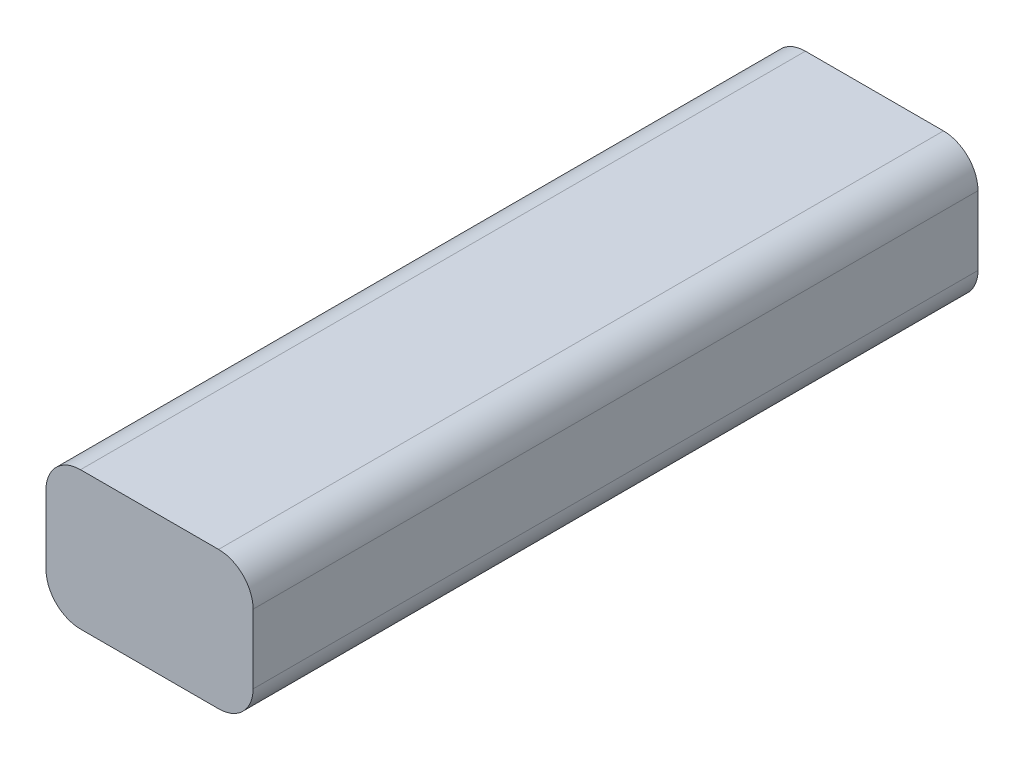
ISO-10303-21;
HEADER;
FILE_DESCRIPTION(('STEP AP214'),'2;1');
FILE_NAME('part.step','',(''),(''),'','','');
FILE_SCHEMA(('AUTOMOTIVE_DESIGN { 1 0 10303 214 1 1 1 1 }'));
ENDSEC;
DATA;
#1=APPLICATION_CONTEXT('core data for automotive mechanical design processes');
#2=APPLICATION_PROTOCOL_DEFINITION('international standard','automotive_design',2000,#1);
#3=PRODUCT_CONTEXT('',#1,'mechanical');
#4=PRODUCT('Part','Part','',(#3));
#5=PRODUCT_RELATED_PRODUCT_CATEGORY('part','',(#4));
#6=PRODUCT_DEFINITION_FORMATION('','',#4);
#7=PRODUCT_DEFINITION_CONTEXT('part definition',#1,'design');
#8=PRODUCT_DEFINITION('design','',#6,#7);
#9=PRODUCT_DEFINITION_SHAPE('','',#8);
#10=(LENGTH_UNIT() NAMED_UNIT(*) SI_UNIT(.MILLI.,.METRE.));
#11=(NAMED_UNIT(*) PLANE_ANGLE_UNIT() SI_UNIT($,.RADIAN.));
#12=(NAMED_UNIT(*) SI_UNIT($,.STERADIAN.) SOLID_ANGLE_UNIT());
#13=UNCERTAINTY_MEASURE_WITH_UNIT(LENGTH_MEASURE(1.E-05),#10,'distance_accuracy_value','');
#14=(GEOMETRIC_REPRESENTATION_CONTEXT(3) GLOBAL_UNCERTAINTY_ASSIGNED_CONTEXT((#13)) GLOBAL_UNIT_ASSIGNED_CONTEXT((#10,
#11,#12)) REPRESENTATION_CONTEXT('',''));
#15=CARTESIAN_POINT('',(0.,0.,0.));
#16=DIRECTION('',(0.,0.,1.));
#17=DIRECTION('',(1.,0.,0.));
#18=AXIS2_PLACEMENT_3D('',#15,#16,#17);
#19=CARTESIAN_POINT('',(650.448656909032,20.,-615.749868458978));
#20=DIRECTION('',(-1.,0.,0.));
#21=DIRECTION('',(0.,0.,1.));
#22=AXIS2_PLACEMENT_3D('',#19,#20,#21);
#23=PLANE('',#22);
#24=DIRECTION('',(0.,-1.,0.));
#25=VECTOR('',#24,1.);
#26=CARTESIAN_POINT('',(650.448656909032,20.,-615.749868458978));
#27=LINE('',#26,#25);
#28=CARTESIAN_POINT('',(650.448656909032,15.,-615.749868458978));
#29=VERTEX_POINT('',#28);
#30=CARTESIAN_POINT('',(650.448656909032,5.,-615.749868458978));
#31=VERTEX_POINT('',#30);
#32=EDGE_CURVE('E121',#29,#31,#27,.T.);
#33=ORIENTED_EDGE('',*,*,#32,.T.);
#34=DIRECTION('',(0.,0.,-1.));
#35=VECTOR('',#34,1.);
#36=CARTESIAN_POINT('',(650.448656909032,5.,-615.749868458978));
#37=LINE('',#36,#35);
#38=CARTESIAN_POINT('',(650.448656909032,5.,-720.749868458978));
#39=VERTEX_POINT('',#38);
#40=EDGE_CURVE('E147',#31,#39,#37,.T.);
#41=ORIENTED_EDGE('',*,*,#40,.T.);
#42=DIRECTION('',(0.,-1.,0.));
#43=VECTOR('',#42,1.);
#44=CARTESIAN_POINT('',(650.448656909032,20.,-720.749868458978));
#45=LINE('',#44,#43);
#46=CARTESIAN_POINT('',(650.448656909032,15.,-720.749868458978));
#47=VERTEX_POINT('',#46);
#48=EDGE_CURVE('E126',#47,#39,#45,.T.);
#49=ORIENTED_EDGE('',*,*,#48,.F.);
#50=DIRECTION('',(0.,0.,-1.));
#51=VECTOR('',#50,1.);
#52=CARTESIAN_POINT('',(650.448656909032,15.,-615.749868458978));
#53=LINE('',#52,#51);
#54=EDGE_CURVE('E145',#47,#29,#53,.F.);
#55=ORIENTED_EDGE('',*,*,#54,.T.);
#56=EDGE_LOOP('',(#33,#41,#49,#55));
#57=FACE_BOUND('',#56,.T.);
#58=ADVANCED_FACE('F33',(#57),#23,.F.);
#59=CARTESIAN_POINT('',(650.448656909032,20.,-720.749868458978));
#60=DIRECTION('',(0.,0.,1.));
#61=DIRECTION('',(1.,0.,0.));
#62=AXIS2_PLACEMENT_3D('',#59,#60,#61);
#63=PLANE('',#62);
#64=DIRECTION('',(-1.,0.,0.));
#65=VECTOR('',#64,1.);
#66=CARTESIAN_POINT('',(650.448656909032,0.,-720.749868458978));
#67=LINE('',#66,#65);
#68=CARTESIAN_POINT('',(645.448656909032,0.,-720.749868458978));
#69=VERTEX_POINT('',#68);
#70=CARTESIAN_POINT('',(625.448656909032,0.,-720.749868458978));
#71=VERTEX_POINT('',#70);
#72=EDGE_CURVE('E162',#69,#71,#67,.T.);
#73=ORIENTED_EDGE('',*,*,#72,.T.);
#74=CARTESIAN_POINT('',(625.448656909032,5.,-720.749868458978));
#75=DIRECTION('',(0.,0.,1.));
#76=DIRECTION('',(1.,0.,0.));
#77=AXIS2_PLACEMENT_3D('',#74,#75,#76);
#78=CIRCLE('',#77,5.);
#79=CARTESIAN_POINT('',(620.448656909032,5.,-720.749868458978));
#80=VERTEX_POINT('',#79);
#81=EDGE_CURVE('E143',#71,#80,#78,.F.);
#82=ORIENTED_EDGE('',*,*,#81,.T.);
#83=DIRECTION('',(0.,-1.,0.));
#84=VECTOR('',#83,1.);
#85=CARTESIAN_POINT('',(620.448656909032,20.,-720.749868458978));
#86=LINE('',#85,#84);
#87=CARTESIAN_POINT('',(620.448656909032,15.,-720.749868458978));
#88=VERTEX_POINT('',#87);
#89=EDGE_CURVE('E120',#88,#80,#86,.T.);
#90=ORIENTED_EDGE('',*,*,#89,.F.);
#91=CARTESIAN_POINT('',(625.448656909032,15.,-720.749868458978));
#92=DIRECTION('',(0.,0.,1.));
#93=DIRECTION('',(1.,0.,0.));
#94=AXIS2_PLACEMENT_3D('',#91,#92,#93);
#95=CIRCLE('',#94,5.);
#96=CARTESIAN_POINT('',(625.448656909032,20.,-720.749868458978));
#97=VERTEX_POINT('',#96);
#98=EDGE_CURVE('E125',#88,#97,#95,.F.);
#99=ORIENTED_EDGE('',*,*,#98,.T.);
#100=DIRECTION('',(-1.,0.,0.));
#101=VECTOR('',#100,1.);
#102=CARTESIAN_POINT('',(650.448656909032,20.,-720.749868458978));
#103=LINE('',#102,#101);
#104=CARTESIAN_POINT('',(645.448656909032,20.,-720.749868458978));
#105=VERTEX_POINT('',#104);
#106=EDGE_CURVE('E153',#105,#97,#103,.T.);
#107=ORIENTED_EDGE('',*,*,#106,.F.);
#108=CARTESIAN_POINT('',(645.448656909032,15.,-720.749868458978));
#109=DIRECTION('',(0.,0.,1.));
#110=DIRECTION('',(1.,0.,0.));
#111=AXIS2_PLACEMENT_3D('',#108,#109,#110);
#112=CIRCLE('',#111,5.);
#113=EDGE_CURVE('E56',#105,#47,#112,.F.);
#114=ORIENTED_EDGE('',*,*,#113,.T.);
#115=ORIENTED_EDGE('',*,*,#48,.T.);
#116=CARTESIAN_POINT('',(645.448656909032,5.,-720.749868458978));
#117=DIRECTION('',(0.,0.,1.));
#118=DIRECTION('',(1.,0.,0.));
#119=AXIS2_PLACEMENT_3D('',#116,#117,#118);
#120=CIRCLE('',#119,5.);
#121=EDGE_CURVE('E48',#39,#69,#120,.F.);
#122=ORIENTED_EDGE('',*,*,#121,.T.);
#123=EDGE_LOOP('',(#73,#82,#90,#99,#107,#114,#115,#122));
#124=FACE_BOUND('',#123,.T.);
#125=ADVANCED_FACE('F157',(#124),#63,.F.);
#126=CARTESIAN_POINT('',(620.448656909032,20.,-615.749868458978));
#127=DIRECTION('',(1.,0.,0.));
#128=DIRECTION('',(0.,0.,-1.));
#129=AXIS2_PLACEMENT_3D('',#126,#127,#128);
#130=PLANE('',#129);
#131=ORIENTED_EDGE('',*,*,#89,.T.);
#132=DIRECTION('',(0.,0.,1.));
#133=VECTOR('',#132,1.);
#134=CARTESIAN_POINT('',(620.448656909032,5.,-615.749868458978));
#135=LINE('',#134,#133);
#136=CARTESIAN_POINT('',(620.448656909032,5.,-615.749868458978));
#137=VERTEX_POINT('',#136);
#138=EDGE_CURVE('E119',#80,#137,#135,.T.);
#139=ORIENTED_EDGE('',*,*,#138,.T.);
#140=DIRECTION('',(0.,-1.,0.));
#141=VECTOR('',#140,1.);
#142=CARTESIAN_POINT('',(620.448656909032,20.,-615.749868458978));
#143=LINE('',#142,#141);
#144=CARTESIAN_POINT('',(620.448656909032,15.,-615.749868458978));
#145=VERTEX_POINT('',#144);
#146=EDGE_CURVE('E103',#145,#137,#143,.T.);
#147=ORIENTED_EDGE('',*,*,#146,.F.);
#148=DIRECTION('',(0.,0.,1.));
#149=VECTOR('',#148,1.);
#150=CARTESIAN_POINT('',(620.448656909032,15.,-720.749868458978));
#151=LINE('',#150,#149);
#152=EDGE_CURVE('E116',#145,#88,#151,.F.);
#153=ORIENTED_EDGE('',*,*,#152,.T.);
#154=EDGE_LOOP('',(#131,#139,#147,#153));
#155=FACE_BOUND('',#154,.T.);
#156=ADVANCED_FACE('F115',(#155),#130,.F.);
#157=CARTESIAN_POINT('',(650.448656909032,20.,-615.749868458978));
#158=DIRECTION('',(0.,0.,-1.));
#159=DIRECTION('',(-1.,0.,0.));
#160=AXIS2_PLACEMENT_3D('',#157,#158,#159);
#161=PLANE('',#160);
#162=ORIENTED_EDGE('',*,*,#146,.T.);
#163=CARTESIAN_POINT('',(625.448656909032,5.,-615.749868458978));
#164=DIRECTION('',(0.,0.,-1.));
#165=DIRECTION('',(-1.,0.,0.));
#166=AXIS2_PLACEMENT_3D('',#163,#164,#165);
#167=CIRCLE('',#166,5.);
#168=CARTESIAN_POINT('',(625.448656909032,0.,-615.749868458978));
#169=VERTEX_POINT('',#168);
#170=EDGE_CURVE('E134',#137,#169,#167,.F.);
#171=ORIENTED_EDGE('',*,*,#170,.T.);
#172=DIRECTION('',(1.,0.,0.));
#173=VECTOR('',#172,1.);
#174=CARTESIAN_POINT('',(650.448656909032,0.,-615.749868458978));
#175=LINE('',#174,#173);
#176=CARTESIAN_POINT('',(645.448656909032,0.,-615.749868458978));
#177=VERTEX_POINT('',#176);
#178=EDGE_CURVE('E158',#169,#177,#175,.T.);
#179=ORIENTED_EDGE('',*,*,#178,.T.);
#180=CARTESIAN_POINT('',(645.448656909032,5.,-615.749868458978));
#181=DIRECTION('',(0.,0.,-1.));
#182=DIRECTION('',(-1.,0.,0.));
#183=AXIS2_PLACEMENT_3D('',#180,#181,#182);
#184=CIRCLE('',#183,5.);
#185=EDGE_CURVE('E109',#177,#31,#184,.F.);
#186=ORIENTED_EDGE('',*,*,#185,.T.);
#187=ORIENTED_EDGE('',*,*,#32,.F.);
#188=CARTESIAN_POINT('',(645.448656909032,15.,-615.749868458978));
#189=DIRECTION('',(0.,0.,-1.));
#190=DIRECTION('',(-1.,0.,0.));
#191=AXIS2_PLACEMENT_3D('',#188,#189,#190);
#192=CIRCLE('',#191,5.);
#193=CARTESIAN_POINT('',(645.448656909032,20.,-615.749868458978));
#194=VERTEX_POINT('',#193);
#195=EDGE_CURVE('E110',#29,#194,#192,.F.);
#196=ORIENTED_EDGE('',*,*,#195,.T.);
#197=DIRECTION('',(1.,0.,0.));
#198=VECTOR('',#197,1.);
#199=CARTESIAN_POINT('',(650.448656909032,20.,-615.749868458978));
#200=LINE('',#199,#198);
#201=CARTESIAN_POINT('',(625.448656909032,20.,-615.749868458978));
#202=VERTEX_POINT('',#201);
#203=EDGE_CURVE('E105',#202,#194,#200,.T.);
#204=ORIENTED_EDGE('',*,*,#203,.F.);
#205=CARTESIAN_POINT('',(625.448656909032,15.,-615.749868458978));
#206=DIRECTION('',(0.,0.,-1.));
#207=DIRECTION('',(-1.,0.,0.));
#208=AXIS2_PLACEMENT_3D('',#205,#206,#207);
#209=CIRCLE('',#208,5.);
#210=EDGE_CURVE('E100',#202,#145,#209,.F.);
#211=ORIENTED_EDGE('',*,*,#210,.T.);
#212=EDGE_LOOP('',(#162,#171,#179,#186,#187,#196,#204,#211));
#213=FACE_BOUND('',#212,.T.);
#214=ADVANCED_FACE('F102',(#213),#161,.F.);
#215=CARTESIAN_POINT('',(0.,20.,0.));
#216=DIRECTION('',(0.,1.,0.));
#217=DIRECTION('',(0.,0.,1.));
#218=AXIS2_PLACEMENT_3D('',#215,#216,#217);
#219=PLANE('',#218);
#220=ORIENTED_EDGE('',*,*,#106,.T.);
#221=DIRECTION('',(0.,0.,1.));
#222=VECTOR('',#221,1.);
#223=CARTESIAN_POINT('',(625.448656909032,20.,-615.749868458978));
#224=LINE('',#223,#222);
#225=EDGE_CURVE('E11',#97,#202,#224,.T.);
#226=ORIENTED_EDGE('',*,*,#225,.T.);
#227=ORIENTED_EDGE('',*,*,#203,.T.);
#228=DIRECTION('',(0.,0.,-1.));
#229=VECTOR('',#228,1.);
#230=CARTESIAN_POINT('',(645.448656909032,20.,-720.749868458978));
#231=LINE('',#230,#229);
#232=EDGE_CURVE('E41',#194,#105,#231,.T.);
#233=ORIENTED_EDGE('',*,*,#232,.T.);
#234=EDGE_LOOP('',(#220,#226,#227,#233));
#235=FACE_BOUND('',#234,.T.);
#236=ADVANCED_FACE('F152',(#235),#219,.T.);
#237=CARTESIAN_POINT('',(0.,0.,0.));
#238=DIRECTION('',(0.,1.,0.));
#239=DIRECTION('',(0.,0.,1.));
#240=AXIS2_PLACEMENT_3D('',#237,#238,#239);
#241=PLANE('',#240);
#242=ORIENTED_EDGE('',*,*,#178,.F.);
#243=DIRECTION('',(0.,0.,1.));
#244=VECTOR('',#243,1.);
#245=CARTESIAN_POINT('',(625.448656909032,0.,0.));
#246=LINE('',#245,#244);
#247=EDGE_CURVE('E138',#169,#71,#246,.F.);
#248=ORIENTED_EDGE('',*,*,#247,.T.);
#249=ORIENTED_EDGE('',*,*,#72,.F.);
#250=DIRECTION('',(0.,0.,-1.));
#251=VECTOR('',#250,1.);
#252=CARTESIAN_POINT('',(645.448656909032,0.,0.));
#253=LINE('',#252,#251);
#254=EDGE_CURVE('E136',#69,#177,#253,.F.);
#255=ORIENTED_EDGE('',*,*,#254,.T.);
#256=EDGE_LOOP('',(#242,#248,#249,#255));
#257=FACE_BOUND('',#256,.T.);
#258=ADVANCED_FACE('F174',(#257),#241,.F.);
#259=CARTESIAN_POINT('',(625.448656909032,5.,-615.749868458978));
#260=DIRECTION('',(0.,0.,1.));
#261=DIRECTION('',(1.,0.,0.));
#262=AXIS2_PLACEMENT_3D('',#259,#260,#261);
#263=CYLINDRICAL_SURFACE('',#262,5.);
#264=ORIENTED_EDGE('',*,*,#81,.F.);
#265=ORIENTED_EDGE('',*,*,#247,.F.);
#266=ORIENTED_EDGE('',*,*,#170,.F.);
#267=ORIENTED_EDGE('',*,*,#138,.F.);
#268=EDGE_LOOP('',(#264,#265,#266,#267));
#269=FACE_BOUND('',#268,.T.);
#270=ADVANCED_FACE('F169',(#269),#263,.T.);
#271=CARTESIAN_POINT('',(645.448656909032,5.,-615.749868458978));
#272=DIRECTION('',(0.,0.,-1.));
#273=DIRECTION('',(-1.,0.,0.));
#274=AXIS2_PLACEMENT_3D('',#271,#272,#273);
#275=CYLINDRICAL_SURFACE('',#274,5.);
#276=ORIENTED_EDGE('',*,*,#185,.F.);
#277=ORIENTED_EDGE('',*,*,#254,.F.);
#278=ORIENTED_EDGE('',*,*,#121,.F.);
#279=ORIENTED_EDGE('',*,*,#40,.F.);
#280=EDGE_LOOP('',(#276,#277,#278,#279));
#281=FACE_BOUND('',#280,.T.);
#282=ADVANCED_FACE('F176',(#281),#275,.T.);
#283=CARTESIAN_POINT('',(625.448656909032,15.,0.));
#284=DIRECTION('',(0.,0.,-1.));
#285=DIRECTION('',(-1.,0.,0.));
#286=AXIS2_PLACEMENT_3D('',#283,#284,#285);
#287=CYLINDRICAL_SURFACE('',#286,5.);
#288=ORIENTED_EDGE('',*,*,#98,.F.);
#289=ORIENTED_EDGE('',*,*,#152,.F.);
#290=ORIENTED_EDGE('',*,*,#210,.F.);
#291=ORIENTED_EDGE('',*,*,#225,.F.);
#292=EDGE_LOOP('',(#288,#289,#290,#291));
#293=FACE_BOUND('',#292,.T.);
#294=ADVANCED_FACE('F124',(#293),#287,.T.);
#295=CARTESIAN_POINT('',(645.448656909032,15.,0.));
#296=DIRECTION('',(0.,0.,1.));
#297=DIRECTION('',(1.,0.,0.));
#298=AXIS2_PLACEMENT_3D('',#295,#296,#297);
#299=CYLINDRICAL_SURFACE('',#298,5.);
#300=ORIENTED_EDGE('',*,*,#195,.F.);
#301=ORIENTED_EDGE('',*,*,#54,.F.);
#302=ORIENTED_EDGE('',*,*,#113,.F.);
#303=ORIENTED_EDGE('',*,*,#232,.F.);
#304=EDGE_LOOP('',(#300,#301,#302,#303));
#305=FACE_BOUND('',#304,.T.);
#306=ADVANCED_FACE('F35',(#305),#299,.T.);
#307=CLOSED_SHELL('',(#58,#125,#156,#214,#236,#258,#270,#282,#294,#306));
#308=MANIFOLD_SOLID_BREP('B2',#307);
#309=ADVANCED_BREP_SHAPE_REPRESENTATION('',(#18,#308),#14);
#310=SHAPE_DEFINITION_REPRESENTATION(#9,#309);
ENDSEC;
END-ISO-10303-21;
